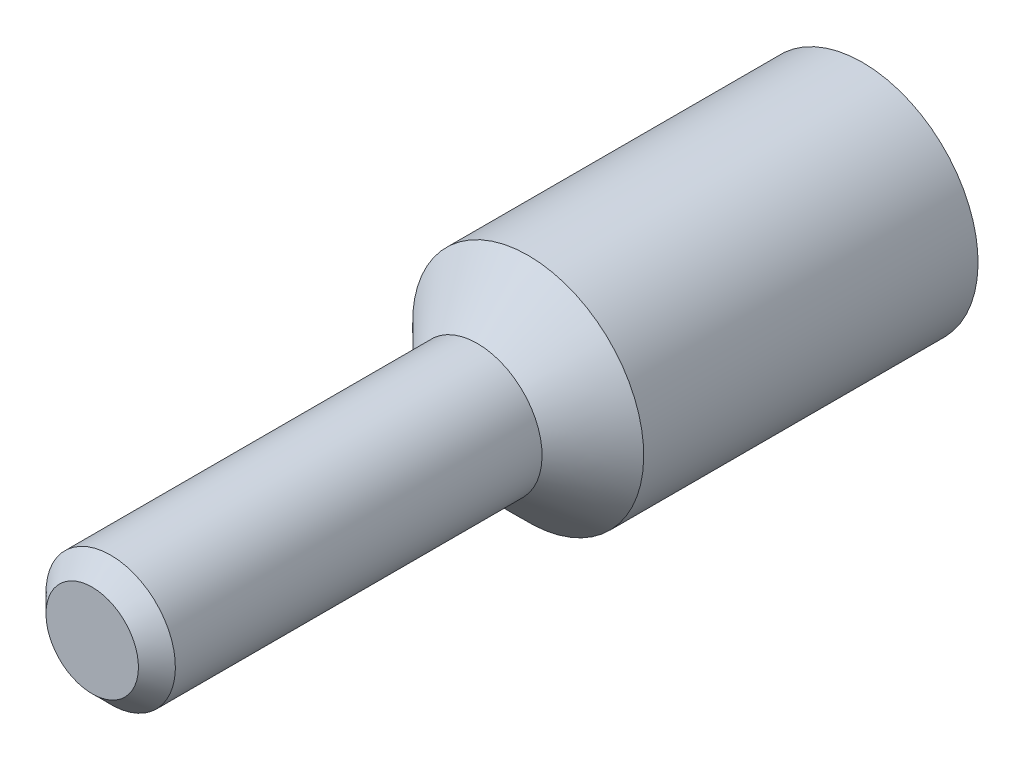
ISO-10303-21;
HEADER;
FILE_DESCRIPTION(('STEP AP214'),'2;1');
FILE_NAME('part.step','',(''),(''),'','','');
FILE_SCHEMA(('AUTOMOTIVE_DESIGN { 1 0 10303 214 1 1 1 1 }'));
ENDSEC;
DATA;
#1=APPLICATION_CONTEXT('core data for automotive mechanical design processes');
#2=APPLICATION_PROTOCOL_DEFINITION('international standard','automotive_design',2000,#1);
#3=PRODUCT_CONTEXT('',#1,'mechanical');
#4=PRODUCT('Part','Part','',(#3));
#5=PRODUCT_RELATED_PRODUCT_CATEGORY('part','',(#4));
#6=PRODUCT_DEFINITION_FORMATION('','',#4);
#7=PRODUCT_DEFINITION_CONTEXT('part definition',#1,'design');
#8=PRODUCT_DEFINITION('design','',#6,#7);
#9=PRODUCT_DEFINITION_SHAPE('','',#8);
#10=(LENGTH_UNIT() NAMED_UNIT(*) SI_UNIT(.MILLI.,.METRE.));
#11=(NAMED_UNIT(*) PLANE_ANGLE_UNIT() SI_UNIT($,.RADIAN.));
#12=(NAMED_UNIT(*) SI_UNIT($,.STERADIAN.) SOLID_ANGLE_UNIT());
#13=UNCERTAINTY_MEASURE_WITH_UNIT(LENGTH_MEASURE(1.E-05),#10,'distance_accuracy_value','');
#14=(GEOMETRIC_REPRESENTATION_CONTEXT(3) GLOBAL_UNCERTAINTY_ASSIGNED_CONTEXT((#13)) GLOBAL_UNIT_ASSIGNED_CONTEXT((#10,
#11,#12)) REPRESENTATION_CONTEXT('',''));
#15=CARTESIAN_POINT('',(0.,0.,0.));
#16=DIRECTION('',(0.,0.,1.));
#17=DIRECTION('',(1.,0.,0.));
#18=AXIS2_PLACEMENT_3D('',#15,#16,#17);
#19=CARTESIAN_POINT('',(0.,7.5,-36.9));
#20=DIRECTION('',(0.,0.,-1.));
#21=DIRECTION('',(0.,1.,0.));
#22=AXIS2_PLACEMENT_3D('',#19,#20,#21);
#23=PLANE('',#22);
#24=CARTESIAN_POINT('',(0.,0.,-36.9));
#25=DIRECTION('',(0.,0.,-1.));
#26=DIRECTION('',(0.,1.,0.));
#27=AXIS2_PLACEMENT_3D('',#24,#25,#26);
#28=CIRCLE('',#27,7.5);
#29=CARTESIAN_POINT('',(0.,7.5,-36.9));
#30=VERTEX_POINT('',#29);
#31=EDGE_CURVE('E60',#30,#30,#28,.T.);
#32=ORIENTED_EDGE('',*,*,#31,.T.);
#33=EDGE_LOOP('',(#32));
#34=FACE_BOUND('',#33,.T.);
#35=ADVANCED_FACE('F37',(#34),#23,.T.);
#36=CARTESIAN_POINT('',(0.,0.,13.1));
#37=DIRECTION('',(0.,0.,1.));
#38=DIRECTION('',(0.,-1.,0.));
#39=AXIS2_PLACEMENT_3D('',#36,#37,#38);
#40=PLANE('',#39);
#41=CARTESIAN_POINT('',(0.,0.,13.1));
#42=DIRECTION('',(0.,0.,-1.));
#43=DIRECTION('',(0.,1.,0.));
#44=AXIS2_PLACEMENT_3D('',#41,#42,#43);
#45=CIRCLE('',#44,3.);
#46=CARTESIAN_POINT('',(0.,3.,13.1));
#47=VERTEX_POINT('',#46);
#48=EDGE_CURVE('E10',#47,#47,#45,.T.);
#49=ORIENTED_EDGE('',*,*,#48,.F.);
#50=EDGE_LOOP('',(#49));
#51=FACE_BOUND('',#50,.T.);
#52=ADVANCED_FACE('F78',(#51),#40,.T.);
#53=CARTESIAN_POINT('',(0.,0.,11.9));
#54=DIRECTION('',(0.,0.,-1.));
#55=DIRECTION('',(0.,1.,0.));
#56=AXIS2_PLACEMENT_3D('',#53,#54,#55);
#57=CONICAL_SURFACE('',#56,4.2,0.78539816339744);
#58=ORIENTED_EDGE('',*,*,#48,.T.);
#59=EDGE_LOOP('',(#58));
#60=FACE_BOUND('',#59,.T.);
#61=CARTESIAN_POINT('',(0.,0.,11.9));
#62=DIRECTION('',(0.,0.,-1.));
#63=DIRECTION('',(0.,1.,0.));
#64=AXIS2_PLACEMENT_3D('',#61,#62,#63);
#65=CIRCLE('',#64,4.2);
#66=CARTESIAN_POINT('',(0.,4.2,11.9));
#67=VERTEX_POINT('',#66);
#68=EDGE_CURVE('E44',#67,#67,#65,.T.);
#69=ORIENTED_EDGE('',*,*,#68,.F.);
#70=EDGE_LOOP('',(#69));
#71=FACE_BOUND('',#70,.T.);
#72=ADVANCED_FACE('F82',(#60,#71),#57,.T.);
#73=CARTESIAN_POINT('',(0.,0.,-36.9));
#74=DIRECTION('',(0.,0.,-1.));
#75=DIRECTION('',(0.,1.,0.));
#76=AXIS2_PLACEMENT_3D('',#73,#74,#75);
#77=CYLINDRICAL_SURFACE('',#76,4.2);
#78=ORIENTED_EDGE('',*,*,#68,.T.);
#79=EDGE_LOOP('',(#78));
#80=FACE_BOUND('',#79,.T.);
#81=CARTESIAN_POINT('',(0.,0.,-11.9));
#82=DIRECTION('',(0.,0.,-1.));
#83=DIRECTION('',(0.,1.,0.));
#84=AXIS2_PLACEMENT_3D('',#81,#82,#83);
#85=CIRCLE('',#84,4.2);
#86=CARTESIAN_POINT('',(0.,4.2,-11.9));
#87=VERTEX_POINT('',#86);
#88=EDGE_CURVE('E49',#87,#87,#85,.T.);
#89=ORIENTED_EDGE('',*,*,#88,.F.);
#90=EDGE_LOOP('',(#89));
#91=FACE_BOUND('',#90,.T.);
#92=ADVANCED_FACE('F74',(#80,#91),#77,.T.);
#93=CARTESIAN_POINT('',(0.,0.,-15.2));
#94=DIRECTION('',(0.,0.,-1.));
#95=DIRECTION('',(0.,1.,0.));
#96=AXIS2_PLACEMENT_3D('',#93,#94,#95);
#97=CONICAL_SURFACE('',#96,7.50000000000001,0.785398163397451);
#98=ORIENTED_EDGE('',*,*,#88,.T.);
#99=EDGE_LOOP('',(#98));
#100=FACE_BOUND('',#99,.T.);
#101=CARTESIAN_POINT('',(0.,0.,-15.2));
#102=DIRECTION('',(0.,0.,-1.));
#103=DIRECTION('',(0.,1.,0.));
#104=AXIS2_PLACEMENT_3D('',#101,#102,#103);
#105=CIRCLE('',#104,7.50000000000001);
#106=CARTESIAN_POINT('',(0.,7.5,-15.2));
#107=VERTEX_POINT('',#106);
#108=EDGE_CURVE('E54',#107,#107,#105,.T.);
#109=ORIENTED_EDGE('',*,*,#108,.F.);
#110=EDGE_LOOP('',(#109));
#111=FACE_BOUND('',#110,.T.);
#112=ADVANCED_FACE('F68',(#100,#111),#97,.T.);
#113=CARTESIAN_POINT('',(0.,0.,-36.9));
#114=DIRECTION('',(0.,0.,-1.));
#115=DIRECTION('',(0.,1.,0.));
#116=AXIS2_PLACEMENT_3D('',#113,#114,#115);
#117=CYLINDRICAL_SURFACE('',#116,7.5);
#118=ORIENTED_EDGE('',*,*,#108,.T.);
#119=EDGE_LOOP('',(#118));
#120=FACE_BOUND('',#119,.T.);
#121=ORIENTED_EDGE('',*,*,#31,.F.);
#122=EDGE_LOOP('',(#121));
#123=FACE_BOUND('',#122,.T.);
#124=ADVANCED_FACE('F66',(#120,#123),#117,.T.);
#125=CLOSED_SHELL('',(#35,#52,#72,#92,#112,#124));
#126=MANIFOLD_SOLID_BREP('B2',#125);
#127=ADVANCED_BREP_SHAPE_REPRESENTATION('',(#18,#126),#14);
#128=SHAPE_DEFINITION_REPRESENTATION(#9,#127);
ENDSEC;
END-ISO-10303-21;
